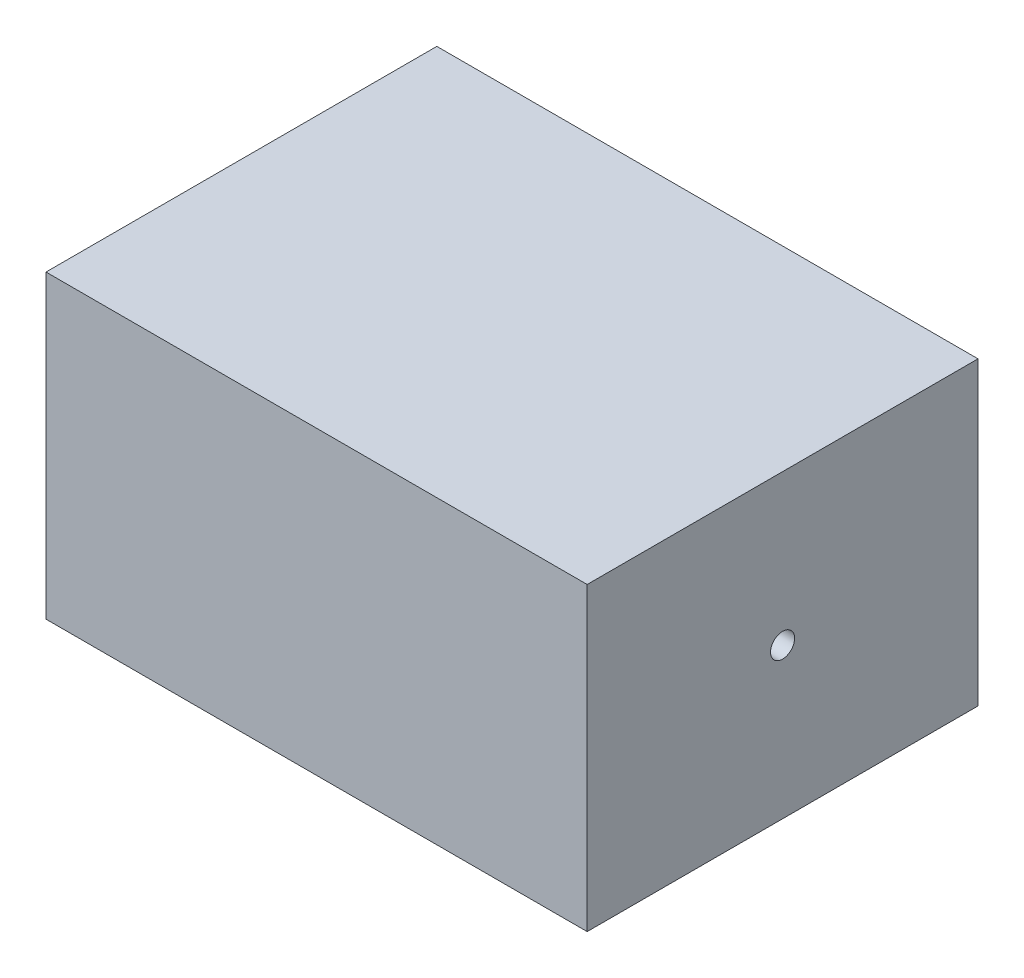
ISO-10303-21;
HEADER;
FILE_DESCRIPTION(('STEP AP214'),'2;1');
FILE_NAME('part.step','',(''),(''),'','','');
FILE_SCHEMA(('AUTOMOTIVE_DESIGN { 1 0 10303 214 1 1 1 1 }'));
ENDSEC;
DATA;
#1=APPLICATION_CONTEXT('core data for automotive mechanical design processes');
#2=APPLICATION_PROTOCOL_DEFINITION('international standard','automotive_design',2000,#1);
#3=PRODUCT_CONTEXT('',#1,'mechanical');
#4=PRODUCT('Part','Part','',(#3));
#5=PRODUCT_RELATED_PRODUCT_CATEGORY('part','',(#4));
#6=PRODUCT_DEFINITION_FORMATION('','',#4);
#7=PRODUCT_DEFINITION_CONTEXT('part definition',#1,'design');
#8=PRODUCT_DEFINITION('design','',#6,#7);
#9=PRODUCT_DEFINITION_SHAPE('','',#8);
#10=(LENGTH_UNIT() NAMED_UNIT(*) SI_UNIT(.MILLI.,.METRE.));
#11=(NAMED_UNIT(*) PLANE_ANGLE_UNIT() SI_UNIT($,.RADIAN.));
#12=(NAMED_UNIT(*) SI_UNIT($,.STERADIAN.) SOLID_ANGLE_UNIT());
#13=UNCERTAINTY_MEASURE_WITH_UNIT(LENGTH_MEASURE(1.E-05),#10,'distance_accuracy_value','');
#14=(GEOMETRIC_REPRESENTATION_CONTEXT(3) GLOBAL_UNCERTAINTY_ASSIGNED_CONTEXT((#13)) GLOBAL_UNIT_ASSIGNED_CONTEXT((#10,
#11,#12)) REPRESENTATION_CONTEXT('',''));
#15=CARTESIAN_POINT('',(0.,0.,0.));
#16=DIRECTION('',(0.,0.,1.));
#17=DIRECTION('',(1.,0.,0.));
#18=AXIS2_PLACEMENT_3D('',#15,#16,#17);
#19=CARTESIAN_POINT('',(-44.7115384615384,29.5673076923077,65.));
#20=DIRECTION('',(1.,0.,0.));
#21=DIRECTION('',(0.,0.,-1.));
#22=AXIS2_PLACEMENT_3D('',#19,#20,#21);
#23=PLANE('',#22);
#24=CARTESIAN_POINT('',(-44.7115384615384,4.5673076923077,32.5));
#25=DIRECTION('',(-1.,0.,0.));
#26=DIRECTION('',(0.,0.,1.));
#27=AXIS2_PLACEMENT_3D('',#24,#25,#26);
#28=CIRCLE('',#27,2.);
#29=CARTESIAN_POINT('',(-44.7115384615384,4.5673076923077,34.5));
#30=VERTEX_POINT('',#29);
#31=EDGE_CURVE('E128',#30,#30,#28,.T.);
#32=ORIENTED_EDGE('',*,*,#31,.F.);
#33=EDGE_LOOP('',(#32));
#34=FACE_BOUND('',#33,.T.);
#35=DIRECTION('',(0.,-1.,0.));
#36=VECTOR('',#35,1.);
#37=CARTESIAN_POINT('',(-44.7115384615384,29.5673076923077,0.));
#38=LINE('',#37,#36);
#39=CARTESIAN_POINT('',(-44.7115384615384,29.5673076923077,0.));
#40=VERTEX_POINT('',#39);
#41=CARTESIAN_POINT('',(-44.7115384615384,-20.4326923076923,0.));
#42=VERTEX_POINT('',#41);
#43=EDGE_CURVE('E107',#40,#42,#38,.T.);
#44=ORIENTED_EDGE('',*,*,#43,.T.);
#45=DIRECTION('',(0.,0.,-1.));
#46=VECTOR('',#45,1.);
#47=CARTESIAN_POINT('',(-44.7115384615384,-20.4326923076923,65.));
#48=LINE('',#47,#46);
#49=CARTESIAN_POINT('',(-44.7115384615384,-20.4326923076923,65.));
#50=VERTEX_POINT('',#49);
#51=EDGE_CURVE('E11',#50,#42,#48,.T.);
#52=ORIENTED_EDGE('',*,*,#51,.F.);
#53=DIRECTION('',(0.,-1.,0.));
#54=VECTOR('',#53,1.);
#55=CARTESIAN_POINT('',(-44.7115384615384,29.5673076923077,65.));
#56=LINE('',#55,#54);
#57=CARTESIAN_POINT('',(-44.7115384615384,29.5673076923077,65.));
#58=VERTEX_POINT('',#57);
#59=EDGE_CURVE('E91',#58,#50,#56,.T.);
#60=ORIENTED_EDGE('',*,*,#59,.F.);
#61=DIRECTION('',(0.,0.,-1.));
#62=VECTOR('',#61,1.);
#63=CARTESIAN_POINT('',(-44.7115384615384,29.5673076923077,65.));
#64=LINE('',#63,#62);
#65=EDGE_CURVE('E103',#58,#40,#64,.T.);
#66=ORIENTED_EDGE('',*,*,#65,.T.);
#67=EDGE_LOOP('',(#44,#52,#60,#66));
#68=FACE_BOUND('',#67,.T.);
#69=ADVANCED_FACE('F39',(#34,#68),#23,.F.);
#70=CARTESIAN_POINT('',(-44.7115384615384,-20.4326923076923,65.));
#71=DIRECTION('',(0.,1.,0.));
#72=DIRECTION('',(0.,0.,1.));
#73=AXIS2_PLACEMENT_3D('',#70,#71,#72);
#74=PLANE('',#73);
#75=DIRECTION('',(1.,0.,0.));
#76=VECTOR('',#75,1.);
#77=CARTESIAN_POINT('',(-44.7115384615384,-20.4326923076923,0.));
#78=LINE('',#77,#76);
#79=CARTESIAN_POINT('',(45.2884615384616,-20.4326923076923,0.));
#80=VERTEX_POINT('',#79);
#81=EDGE_CURVE('E96',#42,#80,#78,.T.);
#82=ORIENTED_EDGE('',*,*,#81,.T.);
#83=DIRECTION('',(0.,0.,-1.));
#84=VECTOR('',#83,1.);
#85=CARTESIAN_POINT('',(45.2884615384616,-20.4326923076923,65.));
#86=LINE('',#85,#84);
#87=CARTESIAN_POINT('',(45.2884615384616,-20.4326923076923,65.));
#88=VERTEX_POINT('',#87);
#89=EDGE_CURVE('E48',#88,#80,#86,.T.);
#90=ORIENTED_EDGE('',*,*,#89,.F.);
#91=DIRECTION('',(1.,0.,0.));
#92=VECTOR('',#91,1.);
#93=CARTESIAN_POINT('',(-44.7115384615384,-20.4326923076923,65.));
#94=LINE('',#93,#92);
#95=EDGE_CURVE('E86',#50,#88,#94,.T.);
#96=ORIENTED_EDGE('',*,*,#95,.F.);
#97=ORIENTED_EDGE('',*,*,#51,.T.);
#98=EDGE_LOOP('',(#82,#90,#96,#97));
#99=FACE_BOUND('',#98,.T.);
#100=ADVANCED_FACE('F95',(#99),#74,.F.);
#101=CARTESIAN_POINT('',(45.2884615384615,29.5673076923077,65.));
#102=DIRECTION('',(-1.,0.,0.));
#103=DIRECTION('',(0.,-1.,0.));
#104=AXIS2_PLACEMENT_3D('',#101,#102,#103);
#105=PLANE('',#104);
#106=CARTESIAN_POINT('',(45.2884615384615,4.5673076923077,32.5));
#107=DIRECTION('',(-1.,0.,0.));
#108=DIRECTION('',(0.,0.,1.));
#109=AXIS2_PLACEMENT_3D('',#106,#107,#108);
#110=CIRCLE('',#109,2.);
#111=CARTESIAN_POINT('',(45.2884615384616,4.5673076923077,34.5));
#112=VERTEX_POINT('',#111);
#113=EDGE_CURVE('E111',#112,#112,#110,.T.);
#114=ORIENTED_EDGE('',*,*,#113,.T.);
#115=EDGE_LOOP('',(#114));
#116=FACE_BOUND('',#115,.T.);
#117=DIRECTION('',(0.,1.,0.));
#118=VECTOR('',#117,1.);
#119=CARTESIAN_POINT('',(45.2884615384615,29.5673076923077,0.));
#120=LINE('',#119,#118);
#121=CARTESIAN_POINT('',(45.2884615384615,29.5673076923077,0.));
#122=VERTEX_POINT('',#121);
#123=EDGE_CURVE('E73',#80,#122,#120,.T.);
#124=ORIENTED_EDGE('',*,*,#123,.T.);
#125=DIRECTION('',(0.,0.,-1.));
#126=VECTOR('',#125,1.);
#127=CARTESIAN_POINT('',(45.2884615384615,29.5673076923077,65.));
#128=LINE('',#127,#126);
#129=CARTESIAN_POINT('',(45.2884615384615,29.5673076923077,65.));
#130=VERTEX_POINT('',#129);
#131=EDGE_CURVE('E98',#130,#122,#128,.T.);
#132=ORIENTED_EDGE('',*,*,#131,.F.);
#133=DIRECTION('',(0.,1.,0.));
#134=VECTOR('',#133,1.);
#135=CARTESIAN_POINT('',(45.2884615384615,29.5673076923077,65.));
#136=LINE('',#135,#134);
#137=EDGE_CURVE('E89',#88,#130,#136,.T.);
#138=ORIENTED_EDGE('',*,*,#137,.F.);
#139=ORIENTED_EDGE('',*,*,#89,.T.);
#140=EDGE_LOOP('',(#124,#132,#138,#139));
#141=FACE_BOUND('',#140,.T.);
#142=ADVANCED_FACE('F99',(#116,#141),#105,.F.);
#143=CARTESIAN_POINT('',(-44.7115384615384,29.5673076923077,65.));
#144=DIRECTION('',(0.,-1.,0.));
#145=DIRECTION('',(0.,0.,-1.));
#146=AXIS2_PLACEMENT_3D('',#143,#144,#145);
#147=PLANE('',#146);
#148=DIRECTION('',(-1.,0.,0.));
#149=VECTOR('',#148,1.);
#150=CARTESIAN_POINT('',(-44.7115384615384,29.5673076923077,0.));
#151=LINE('',#150,#149);
#152=EDGE_CURVE('E79',#122,#40,#151,.T.);
#153=ORIENTED_EDGE('',*,*,#152,.T.);
#154=ORIENTED_EDGE('',*,*,#65,.F.);
#155=DIRECTION('',(-1.,0.,0.));
#156=VECTOR('',#155,1.);
#157=CARTESIAN_POINT('',(-44.7115384615384,29.5673076923077,65.));
#158=LINE('',#157,#156);
#159=EDGE_CURVE('E56',#130,#58,#158,.T.);
#160=ORIENTED_EDGE('',*,*,#159,.F.);
#161=ORIENTED_EDGE('',*,*,#131,.T.);
#162=EDGE_LOOP('',(#153,#154,#160,#161));
#163=FACE_BOUND('',#162,.T.);
#164=ADVANCED_FACE('F121',(#163),#147,.F.);
#165=CARTESIAN_POINT('',(0.,0.,65.));
#166=DIRECTION('',(0.,0.,1.));
#167=DIRECTION('',(1.,0.,0.));
#168=AXIS2_PLACEMENT_3D('',#165,#166,#167);
#169=PLANE('',#168);
#170=ORIENTED_EDGE('',*,*,#59,.T.);
#171=ORIENTED_EDGE('',*,*,#95,.T.);
#172=ORIENTED_EDGE('',*,*,#137,.T.);
#173=ORIENTED_EDGE('',*,*,#159,.T.);
#174=EDGE_LOOP('',(#170,#171,#172,#173));
#175=FACE_BOUND('',#174,.T.);
#176=ADVANCED_FACE('F87',(#175),#169,.T.);
#177=CARTESIAN_POINT('',(0.,0.,0.));
#178=DIRECTION('',(0.,0.,1.));
#179=DIRECTION('',(1.,0.,0.));
#180=AXIS2_PLACEMENT_3D('',#177,#178,#179);
#181=PLANE('',#180);
#182=ORIENTED_EDGE('',*,*,#43,.F.);
#183=ORIENTED_EDGE('',*,*,#152,.F.);
#184=ORIENTED_EDGE('',*,*,#123,.F.);
#185=ORIENTED_EDGE('',*,*,#81,.F.);
#186=EDGE_LOOP('',(#182,#183,#184,#185));
#187=FACE_BOUND('',#186,.T.);
#188=ADVANCED_FACE('F124',(#187),#181,.F.);
#189=CARTESIAN_POINT('',(45.2884615384615,4.5673076923077,32.5));
#190=DIRECTION('',(-1.,0.,0.));
#191=DIRECTION('',(0.,0.,1.));
#192=AXIS2_PLACEMENT_3D('',#189,#190,#191);
#193=CYLINDRICAL_SURFACE('',#192,2.);
#194=CARTESIAN_POINT('',(45.2884615384616,4.5673076923077,34.5));
#195=CARTESIAN_POINT('',(44.3509615384616,4.5673076923077,34.5));
#196=CARTESIAN_POINT('',(43.4134615384616,4.5673076923077,34.5));
#197=CARTESIAN_POINT('',(41.5384615384616,4.5673076923077,34.5));
#198=CARTESIAN_POINT('',(40.6009615384616,4.5673076923077,34.5));
#199=CARTESIAN_POINT('',(38.7259615384615,4.5673076923077,34.5));
#200=CARTESIAN_POINT('',(37.7884615384616,4.5673076923077,34.5));
#201=CARTESIAN_POINT('',(35.9134615384616,4.5673076923077,34.5));
#202=CARTESIAN_POINT('',(34.9759615384616,4.5673076923077,34.5));
#203=CARTESIAN_POINT('',(33.1009615384616,4.5673076923077,34.5));
#204=CARTESIAN_POINT('',(32.1634615384616,4.5673076923077,34.5));
#205=CARTESIAN_POINT('',(30.2884615384616,4.5673076923077,34.5));
#206=CARTESIAN_POINT('',(29.3509615384616,4.5673076923077,34.5));
#207=CARTESIAN_POINT('',(27.4759615384616,4.5673076923077,34.5));
#208=CARTESIAN_POINT('',(26.5384615384616,4.5673076923077,34.5));
#209=CARTESIAN_POINT('',(24.6634615384616,4.5673076923077,34.5));
#210=CARTESIAN_POINT('',(23.7259615384616,4.5673076923077,34.5));
#211=CARTESIAN_POINT('',(21.8509615384616,4.5673076923077,34.5));
#212=CARTESIAN_POINT('',(20.9134615384616,4.5673076923077,34.5));
#213=CARTESIAN_POINT('',(19.0384615384616,4.5673076923077,34.5));
#214=CARTESIAN_POINT('',(18.1009615384616,4.5673076923077,34.5));
#215=CARTESIAN_POINT('',(16.2259615384616,4.5673076923077,34.5));
#216=CARTESIAN_POINT('',(15.2884615384616,4.5673076923077,34.5));
#217=CARTESIAN_POINT('',(13.4134615384616,4.5673076923077,34.5));
#218=CARTESIAN_POINT('',(12.4759615384616,4.5673076923077,34.5));
#219=CARTESIAN_POINT('',(10.6009615384616,4.5673076923077,34.5));
#220=CARTESIAN_POINT('',(9.66346153846156,4.5673076923077,34.5));
#221=CARTESIAN_POINT('',(7.78846153846156,4.5673076923077,34.5));
#222=CARTESIAN_POINT('',(6.85096153846156,4.5673076923077,34.5));
#223=CARTESIAN_POINT('',(4.97596153846156,4.5673076923077,34.5));
#224=CARTESIAN_POINT('',(4.03846153846156,4.5673076923077,34.5));
#225=CARTESIAN_POINT('',(2.16346153846157,4.5673076923077,34.5));
#226=CARTESIAN_POINT('',(1.22596153846156,4.5673076923077,34.5));
#227=CARTESIAN_POINT('',(-0.649038461538437,4.5673076923077,34.5));
#228=CARTESIAN_POINT('',(-1.58653846153844,4.5673076923077,34.5));
#229=CARTESIAN_POINT('',(-3.46153846153844,4.5673076923077,34.5));
#230=CARTESIAN_POINT('',(-4.39903846153844,4.5673076923077,34.5));
#231=CARTESIAN_POINT('',(-6.27403846153844,4.5673076923077,34.5));
#232=CARTESIAN_POINT('',(-7.21153846153844,4.5673076923077,34.5));
#233=CARTESIAN_POINT('',(-9.08653846153844,4.5673076923077,34.5));
#234=CARTESIAN_POINT('',(-10.0240384615384,4.5673076923077,34.5));
#235=CARTESIAN_POINT('',(-11.8990384615384,4.5673076923077,34.5));
#236=CARTESIAN_POINT('',(-12.8365384615384,4.5673076923077,34.5));
#237=CARTESIAN_POINT('',(-14.7115384615384,4.5673076923077,34.5));
#238=CARTESIAN_POINT('',(-15.6490384615384,4.5673076923077,34.5));
#239=CARTESIAN_POINT('',(-17.5240384615384,4.5673076923077,34.5));
#240=CARTESIAN_POINT('',(-18.4615384615384,4.5673076923077,34.5));
#241=CARTESIAN_POINT('',(-20.3365384615384,4.5673076923077,34.5));
#242=CARTESIAN_POINT('',(-21.2740384615384,4.5673076923077,34.5));
#243=CARTESIAN_POINT('',(-23.1490384615384,4.5673076923077,34.5));
#244=CARTESIAN_POINT('',(-24.0865384615384,4.5673076923077,34.5));
#245=CARTESIAN_POINT('',(-25.9615384615384,4.5673076923077,34.5));
#246=CARTESIAN_POINT('',(-26.8990384615384,4.5673076923077,34.5));
#247=CARTESIAN_POINT('',(-28.7740384615384,4.5673076923077,34.5));
#248=CARTESIAN_POINT('',(-29.7115384615384,4.5673076923077,34.5));
#249=CARTESIAN_POINT('',(-31.5865384615384,4.5673076923077,34.5));
#250=CARTESIAN_POINT('',(-32.5240384615384,4.5673076923077,34.5));
#251=CARTESIAN_POINT('',(-34.3990384615384,4.5673076923077,34.5));
#252=CARTESIAN_POINT('',(-35.3365384615384,4.5673076923077,34.5));
#253=CARTESIAN_POINT('',(-37.2115384615384,4.5673076923077,34.5));
#254=CARTESIAN_POINT('',(-38.1490384615384,4.5673076923077,34.5));
#255=CARTESIAN_POINT('',(-40.0240384615384,4.5673076923077,34.5));
#256=CARTESIAN_POINT('',(-40.9615384615384,4.5673076923077,34.5));
#257=CARTESIAN_POINT('',(-42.8365384615384,4.5673076923077,34.5));
#258=CARTESIAN_POINT('',(-43.7740384615384,4.5673076923077,34.5));
#259=CARTESIAN_POINT('',(-44.7115384615384,4.5673076923077,34.5));
#260=B_SPLINE_CURVE_WITH_KNOTS('',3,(#194,#195,#196,#197,#198,#199,#200,#201,#202,#203,#204,
#205,#206,#207,#208,#209,#210,#211,#212,#213,#214,#215,#216,#217,#218,#219,#220,#221,#222,#223,
#224,#225,#226,#227,#228,#229,#230,#231,#232,#233,#234,#235,#236,#237,#238,#239,#240,#241,#242,
#243,#244,#245,#246,#247,#248,#249,#250,#251,#252,#253,#254,#255,#256,#257,#258,#259),
.UNSPECIFIED.,.F.,.F.,(4,2,2,2,2,2,2,2,2,2,2,2,2,2,2,2,2,2,2,2,2,2,2,2,2,2,2,2,2,2,2,2,4),(0.,
2.8125,5.62500000000001,8.4375,11.25,14.0625,16.875,19.6875,22.5,25.3125,28.125,30.9375,33.75,
36.5625,39.375,42.1875,45.,47.8125,50.625,53.4375,56.25,59.0625,61.875,64.6875,67.5,70.3125,
73.125,75.9375,78.75,81.5625,84.375,87.1875,90.),.UNSPECIFIED.);
#261=EDGE_CURVE('BSEAM137',#112,#30,#260,.T.);
#262=ORIENTED_EDGE('',*,*,#113,.F.);
#263=ORIENTED_EDGE('',*,*,#31,.T.);
#264=ORIENTED_EDGE('',*,*,#261,.T.);
#265=ORIENTED_EDGE('',*,*,#261,.F.);
#266=EDGE_LOOP('',(#262,#264,#263,#265));
#267=FACE_BOUND('',#266,.T.);
#268=ADVANCED_FACE('F137',(#267),#193,.F.);
#269=CLOSED_SHELL('',(#69,#100,#142,#164,#176,#188,#268));
#270=MANIFOLD_SOLID_BREP('B2',#269);
#271=ADVANCED_BREP_SHAPE_REPRESENTATION('',(#18,#270),#14);
#272=SHAPE_DEFINITION_REPRESENTATION(#9,#271);
ENDSEC;
END-ISO-10303-21;
